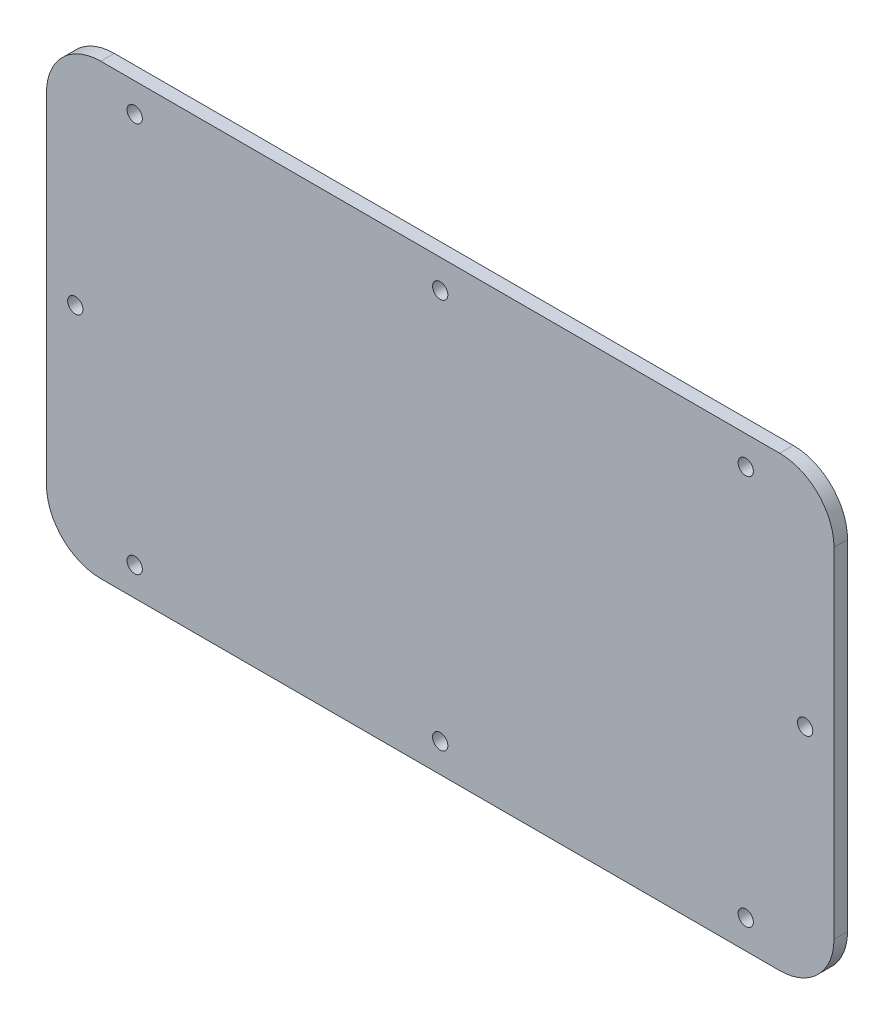
ISO-10303-21;
HEADER;
FILE_DESCRIPTION(('STEP AP214'),'2;1');
FILE_NAME('part.step','',(''),(''),'','','');
FILE_SCHEMA(('AUTOMOTIVE_DESIGN { 1 0 10303 214 1 1 1 1 }'));
ENDSEC;
DATA;
#1=APPLICATION_CONTEXT('core data for automotive mechanical design processes');
#2=APPLICATION_PROTOCOL_DEFINITION('international standard','automotive_design',2000,#1);
#3=PRODUCT_CONTEXT('',#1,'mechanical');
#4=PRODUCT('Part','Part','',(#3));
#5=PRODUCT_RELATED_PRODUCT_CATEGORY('part','',(#4));
#6=PRODUCT_DEFINITION_FORMATION('','',#4);
#7=PRODUCT_DEFINITION_CONTEXT('part definition',#1,'design');
#8=PRODUCT_DEFINITION('design','',#6,#7);
#9=PRODUCT_DEFINITION_SHAPE('','',#8);
#10=(LENGTH_UNIT() NAMED_UNIT(*) SI_UNIT(.MILLI.,.METRE.));
#11=(NAMED_UNIT(*) PLANE_ANGLE_UNIT() SI_UNIT($,.RADIAN.));
#12=(NAMED_UNIT(*) SI_UNIT($,.STERADIAN.) SOLID_ANGLE_UNIT());
#13=UNCERTAINTY_MEASURE_WITH_UNIT(LENGTH_MEASURE(1.E-05),#10,'distance_accuracy_value','');
#14=(GEOMETRIC_REPRESENTATION_CONTEXT(3) GLOBAL_UNCERTAINTY_ASSIGNED_CONTEXT((#13)) GLOBAL_UNIT_ASSIGNED_CONTEXT((#10,
#11,#12)) REPRESENTATION_CONTEXT('',''));
#15=CARTESIAN_POINT('',(0.,0.,0.));
#16=DIRECTION('',(0.,0.,1.));
#17=DIRECTION('',(1.,0.,0.));
#18=AXIS2_PLACEMENT_3D('',#15,#16,#17);
#19=CARTESIAN_POINT('',(-116.,-66.,-4.));
#20=DIRECTION('',(-1.,0.,0.));
#21=DIRECTION('',(0.,0.,1.));
#22=AXIS2_PLACEMENT_3D('',#19,#20,#21);
#23=PLANE('',#22);
#24=DIRECTION('',(0.,-1.,0.));
#25=VECTOR('',#24,1.);
#26=CARTESIAN_POINT('',(-116.,-66.,-4.));
#27=LINE('',#26,#25);
#28=CARTESIAN_POINT('',(-116.,50.,-4.));
#29=VERTEX_POINT('',#28);
#30=CARTESIAN_POINT('',(-116.,-50.,-4.));
#31=VERTEX_POINT('',#30);
#32=EDGE_CURVE('E167',#29,#31,#27,.T.);
#33=ORIENTED_EDGE('',*,*,#32,.T.);
#34=DIRECTION('',(0.,0.,1.));
#35=VECTOR('',#34,1.);
#36=CARTESIAN_POINT('',(-116.,-50.,-4.));
#37=LINE('',#36,#35);
#38=CARTESIAN_POINT('',(-116.,-50.,0.));
#39=VERTEX_POINT('',#38);
#40=EDGE_CURVE('E11',#31,#39,#37,.T.);
#41=ORIENTED_EDGE('',*,*,#40,.T.);
#42=DIRECTION('',(0.,-1.,0.));
#43=VECTOR('',#42,1.);
#44=CARTESIAN_POINT('',(-116.,-66.,0.));
#45=LINE('',#44,#43);
#46=CARTESIAN_POINT('',(-116.,50.,0.));
#47=VERTEX_POINT('',#46);
#48=EDGE_CURVE('E117',#47,#39,#45,.T.);
#49=ORIENTED_EDGE('',*,*,#48,.F.);
#50=DIRECTION('',(0.,0.,1.));
#51=VECTOR('',#50,1.);
#52=CARTESIAN_POINT('',(-116.,50.,-4.));
#53=LINE('',#52,#51);
#54=EDGE_CURVE('E53',#47,#29,#53,.F.);
#55=ORIENTED_EDGE('',*,*,#54,.T.);
#56=EDGE_LOOP('',(#33,#41,#49,#55));
#57=FACE_BOUND('',#56,.T.);
#58=ADVANCED_FACE('F45',(#57),#23,.T.);
#59=CARTESIAN_POINT('',(116.,66.,-4.));
#60=DIRECTION('',(0.,1.,0.));
#61=DIRECTION('',(-1.,0.,0.));
#62=AXIS2_PLACEMENT_3D('',#59,#60,#61);
#63=PLANE('',#62);
#64=DIRECTION('',(-1.,0.,0.));
#65=VECTOR('',#64,1.);
#66=CARTESIAN_POINT('',(116.,66.,0.));
#67=LINE('',#66,#65);
#68=CARTESIAN_POINT('',(100.,66.,0.));
#69=VERTEX_POINT('',#68);
#70=CARTESIAN_POINT('',(-100.,66.,0.));
#71=VERTEX_POINT('',#70);
#72=EDGE_CURVE('E143',#69,#71,#67,.T.);
#73=ORIENTED_EDGE('',*,*,#72,.F.);
#74=DIRECTION('',(0.,0.,1.));
#75=VECTOR('',#74,1.);
#76=CARTESIAN_POINT('',(100.,66.,-4.));
#77=LINE('',#76,#75);
#78=CARTESIAN_POINT('',(100.,66.,-4.));
#79=VERTEX_POINT('',#78);
#80=EDGE_CURVE('E67',#69,#79,#77,.F.);
#81=ORIENTED_EDGE('',*,*,#80,.T.);
#82=DIRECTION('',(-1.,0.,0.));
#83=VECTOR('',#82,1.);
#84=CARTESIAN_POINT('',(116.,66.,-4.));
#85=LINE('',#84,#83);
#86=CARTESIAN_POINT('',(-100.,66.,-4.));
#87=VERTEX_POINT('',#86);
#88=EDGE_CURVE('E137',#79,#87,#85,.T.);
#89=ORIENTED_EDGE('',*,*,#88,.T.);
#90=DIRECTION('',(0.,0.,1.));
#91=VECTOR('',#90,1.);
#92=CARTESIAN_POINT('',(-100.,66.,-4.));
#93=LINE('',#92,#91);
#94=EDGE_CURVE('E161',#87,#71,#93,.T.);
#95=ORIENTED_EDGE('',*,*,#94,.T.);
#96=EDGE_LOOP('',(#73,#81,#89,#95));
#97=FACE_BOUND('',#96,.T.);
#98=ADVANCED_FACE('F175',(#97),#63,.T.);
#99=CARTESIAN_POINT('',(116.,-66.,-4.));
#100=DIRECTION('',(1.,0.,0.));
#101=DIRECTION('',(0.,0.,-1.));
#102=AXIS2_PLACEMENT_3D('',#99,#100,#101);
#103=PLANE('',#102);
#104=DIRECTION('',(0.,1.,0.));
#105=VECTOR('',#104,1.);
#106=CARTESIAN_POINT('',(116.,-66.,0.));
#107=LINE('',#106,#105);
#108=CARTESIAN_POINT('',(116.,-50.,0.));
#109=VERTEX_POINT('',#108);
#110=CARTESIAN_POINT('',(116.,50.,0.));
#111=VERTEX_POINT('',#110);
#112=EDGE_CURVE('E132',#109,#111,#107,.T.);
#113=ORIENTED_EDGE('',*,*,#112,.F.);
#114=DIRECTION('',(0.,0.,1.));
#115=VECTOR('',#114,1.);
#116=CARTESIAN_POINT('',(116.,-50.,-4.));
#117=LINE('',#116,#115);
#118=CARTESIAN_POINT('',(116.,-50.,-4.));
#119=VERTEX_POINT('',#118);
#120=EDGE_CURVE('E153',#109,#119,#117,.F.);
#121=ORIENTED_EDGE('',*,*,#120,.T.);
#122=DIRECTION('',(0.,1.,0.));
#123=VECTOR('',#122,1.);
#124=CARTESIAN_POINT('',(116.,-66.,-4.));
#125=LINE('',#124,#123);
#126=CARTESIAN_POINT('',(116.,50.,-4.));
#127=VERTEX_POINT('',#126);
#128=EDGE_CURVE('E140',#119,#127,#125,.T.);
#129=ORIENTED_EDGE('',*,*,#128,.T.);
#130=DIRECTION('',(0.,0.,1.));
#131=VECTOR('',#130,1.);
#132=CARTESIAN_POINT('',(116.,50.,-4.));
#133=LINE('',#132,#131);
#134=EDGE_CURVE('E150',#127,#111,#133,.T.);
#135=ORIENTED_EDGE('',*,*,#134,.T.);
#136=EDGE_LOOP('',(#113,#121,#129,#135));
#137=FACE_BOUND('',#136,.T.);
#138=ADVANCED_FACE('F277',(#137),#103,.T.);
#139=CARTESIAN_POINT('',(116.,-66.,-4.));
#140=DIRECTION('',(0.,-1.,0.));
#141=DIRECTION('',(1.,0.,0.));
#142=AXIS2_PLACEMENT_3D('',#139,#140,#141);
#143=PLANE('',#142);
#144=DIRECTION('',(1.,0.,0.));
#145=VECTOR('',#144,1.);
#146=CARTESIAN_POINT('',(116.,-66.,-4.));
#147=LINE('',#146,#145);
#148=CARTESIAN_POINT('',(-100.,-66.,-4.));
#149=VERTEX_POINT('',#148);
#150=CARTESIAN_POINT('',(100.,-66.,-4.));
#151=VERTEX_POINT('',#150);
#152=EDGE_CURVE('E171',#149,#151,#147,.T.);
#153=ORIENTED_EDGE('',*,*,#152,.T.);
#154=DIRECTION('',(0.,0.,1.));
#155=VECTOR('',#154,1.);
#156=CARTESIAN_POINT('',(100.,-66.,-4.));
#157=LINE('',#156,#155);
#158=CARTESIAN_POINT('',(100.,-66.,0.));
#159=VERTEX_POINT('',#158);
#160=EDGE_CURVE('E131',#151,#159,#157,.T.);
#161=ORIENTED_EDGE('',*,*,#160,.T.);
#162=DIRECTION('',(1.,0.,0.));
#163=VECTOR('',#162,1.);
#164=CARTESIAN_POINT('',(116.,-66.,0.));
#165=LINE('',#164,#163);
#166=CARTESIAN_POINT('',(-100.,-66.,0.));
#167=VERTEX_POINT('',#166);
#168=EDGE_CURVE('E115',#167,#159,#165,.T.);
#169=ORIENTED_EDGE('',*,*,#168,.F.);
#170=DIRECTION('',(0.,0.,1.));
#171=VECTOR('',#170,1.);
#172=CARTESIAN_POINT('',(-100.,-66.,-4.));
#173=LINE('',#172,#171);
#174=EDGE_CURVE('E128',#167,#149,#173,.F.);
#175=ORIENTED_EDGE('',*,*,#174,.T.);
#176=EDGE_LOOP('',(#153,#161,#169,#175));
#177=FACE_BOUND('',#176,.T.);
#178=ADVANCED_FACE('F127',(#177),#143,.T.);
#179=CARTESIAN_POINT('',(0.,0.,-4.));
#180=DIRECTION('',(0.,0.,1.));
#181=DIRECTION('',(1.,0.,0.));
#182=AXIS2_PLACEMENT_3D('',#179,#180,#181);
#183=PLANE('',#182);
#184=CARTESIAN_POINT('',(-90.,-57.5,-4.));
#185=DIRECTION('',(0.,0.,1.));
#186=DIRECTION('',(-1.,0.,0.));
#187=AXIS2_PLACEMENT_3D('',#184,#185,#186);
#188=CIRCLE('',#187,2.25);
#189=CARTESIAN_POINT('',(-92.25,-57.5,-4.));
#190=VERTEX_POINT('',#189);
#191=EDGE_CURVE('E223',#190,#190,#188,.T.);
#192=ORIENTED_EDGE('',*,*,#191,.T.);
#193=EDGE_LOOP('',(#192));
#194=FACE_BOUND('',#193,.T.);
#195=CARTESIAN_POINT('',(0.,-57.5,-4.));
#196=DIRECTION('',(0.,0.,1.));
#197=DIRECTION('',(-1.,0.,0.));
#198=AXIS2_PLACEMENT_3D('',#195,#196,#197);
#199=CIRCLE('',#198,2.25);
#200=CARTESIAN_POINT('',(-2.25,-57.5,-4.));
#201=VERTEX_POINT('',#200);
#202=EDGE_CURVE('E217',#201,#201,#199,.T.);
#203=ORIENTED_EDGE('',*,*,#202,.T.);
#204=EDGE_LOOP('',(#203));
#205=FACE_BOUND('',#204,.T.);
#206=CARTESIAN_POINT('',(90.,-57.5,-4.));
#207=DIRECTION('',(0.,0.,1.));
#208=DIRECTION('',(-1.,0.,0.));
#209=AXIS2_PLACEMENT_3D('',#206,#207,#208);
#210=CIRCLE('',#209,2.25);
#211=CARTESIAN_POINT('',(87.75,-57.5,-4.));
#212=VERTEX_POINT('',#211);
#213=EDGE_CURVE('E211',#212,#212,#210,.T.);
#214=ORIENTED_EDGE('',*,*,#213,.T.);
#215=EDGE_LOOP('',(#214));
#216=FACE_BOUND('',#215,.T.);
#217=CARTESIAN_POINT('',(107.5,0.,-4.));
#218=DIRECTION('',(0.,0.,1.));
#219=DIRECTION('',(1.,0.,0.));
#220=AXIS2_PLACEMENT_3D('',#217,#218,#219);
#221=CIRCLE('',#220,2.25);
#222=CARTESIAN_POINT('',(109.75,0.,-4.));
#223=VERTEX_POINT('',#222);
#224=EDGE_CURVE('E205',#223,#223,#221,.T.);
#225=ORIENTED_EDGE('',*,*,#224,.T.);
#226=EDGE_LOOP('',(#225));
#227=FACE_BOUND('',#226,.T.);
#228=CARTESIAN_POINT('',(-107.5,0.,-4.));
#229=DIRECTION('',(0.,0.,1.));
#230=DIRECTION('',(1.,0.,0.));
#231=AXIS2_PLACEMENT_3D('',#228,#229,#230);
#232=CIRCLE('',#231,2.25);
#233=CARTESIAN_POINT('',(-105.25,0.,-4.));
#234=VERTEX_POINT('',#233);
#235=EDGE_CURVE('E199',#234,#234,#232,.T.);
#236=ORIENTED_EDGE('',*,*,#235,.T.);
#237=EDGE_LOOP('',(#236));
#238=FACE_BOUND('',#237,.T.);
#239=CARTESIAN_POINT('',(90.,57.5,-4.));
#240=DIRECTION('',(0.,0.,1.));
#241=DIRECTION('',(1.,0.,0.));
#242=AXIS2_PLACEMENT_3D('',#239,#240,#241);
#243=CIRCLE('',#242,2.25);
#244=CARTESIAN_POINT('',(92.25,57.5,-4.));
#245=VERTEX_POINT('',#244);
#246=EDGE_CURVE('E193',#245,#245,#243,.T.);
#247=ORIENTED_EDGE('',*,*,#246,.T.);
#248=EDGE_LOOP('',(#247));
#249=FACE_BOUND('',#248,.T.);
#250=CARTESIAN_POINT('',(-90.,57.5,-4.));
#251=DIRECTION('',(0.,0.,1.));
#252=DIRECTION('',(1.,0.,0.));
#253=AXIS2_PLACEMENT_3D('',#250,#251,#252);
#254=CIRCLE('',#253,2.25);
#255=CARTESIAN_POINT('',(-87.75,57.5,-4.));
#256=VERTEX_POINT('',#255);
#257=EDGE_CURVE('E187',#256,#256,#254,.T.);
#258=ORIENTED_EDGE('',*,*,#257,.T.);
#259=EDGE_LOOP('',(#258));
#260=FACE_BOUND('',#259,.T.);
#261=CARTESIAN_POINT('',(0.,57.5,-4.));
#262=DIRECTION('',(0.,0.,1.));
#263=DIRECTION('',(1.,0.,0.));
#264=AXIS2_PLACEMENT_3D('',#261,#262,#263);
#265=CIRCLE('',#264,2.25);
#266=CARTESIAN_POINT('',(2.25,57.5,-4.));
#267=VERTEX_POINT('',#266);
#268=EDGE_CURVE('E179',#267,#267,#265,.T.);
#269=ORIENTED_EDGE('',*,*,#268,.T.);
#270=EDGE_LOOP('',(#269));
#271=FACE_BOUND('',#270,.T.);
#272=ORIENTED_EDGE('',*,*,#128,.F.);
#273=CARTESIAN_POINT('',(100.,-50.,-4.));
#274=DIRECTION('',(0.,0.,1.));
#275=DIRECTION('',(1.,0.,0.));
#276=AXIS2_PLACEMENT_3D('',#273,#274,#275);
#277=CIRCLE('',#276,16.);
#278=EDGE_CURVE('E159',#119,#151,#277,.F.);
#279=ORIENTED_EDGE('',*,*,#278,.T.);
#280=ORIENTED_EDGE('',*,*,#152,.F.);
#281=CARTESIAN_POINT('',(-100.,-50.,-4.));
#282=DIRECTION('',(0.,0.,1.));
#283=DIRECTION('',(1.,0.,0.));
#284=AXIS2_PLACEMENT_3D('',#281,#282,#283);
#285=CIRCLE('',#284,16.);
#286=EDGE_CURVE('E136',#149,#31,#285,.F.);
#287=ORIENTED_EDGE('',*,*,#286,.T.);
#288=ORIENTED_EDGE('',*,*,#32,.F.);
#289=CARTESIAN_POINT('',(-100.,50.,-4.));
#290=DIRECTION('',(0.,0.,1.));
#291=DIRECTION('',(1.,0.,0.));
#292=AXIS2_PLACEMENT_3D('',#289,#290,#291);
#293=CIRCLE('',#292,16.);
#294=EDGE_CURVE('E60',#29,#87,#293,.F.);
#295=ORIENTED_EDGE('',*,*,#294,.T.);
#296=ORIENTED_EDGE('',*,*,#88,.F.);
#297=CARTESIAN_POINT('',(100.,50.,-4.));
#298=DIRECTION('',(0.,0.,1.));
#299=DIRECTION('',(1.,0.,0.));
#300=AXIS2_PLACEMENT_3D('',#297,#298,#299);
#301=CIRCLE('',#300,16.);
#302=EDGE_CURVE('E157',#79,#127,#301,.F.);
#303=ORIENTED_EDGE('',*,*,#302,.T.);
#304=EDGE_LOOP('',(#272,#279,#280,#287,#288,#295,#296,#303));
#305=FACE_BOUND('',#304,.T.);
#306=ADVANCED_FACE('F170',(#194,#205,#216,#227,#238,#249,#260,#271,#305),#183,.F.);
#307=CARTESIAN_POINT('',(0.,0.,0.));
#308=DIRECTION('',(0.,0.,1.));
#309=DIRECTION('',(1.,0.,0.));
#310=AXIS2_PLACEMENT_3D('',#307,#308,#309);
#311=PLANE('',#310);
#312=CARTESIAN_POINT('',(-90.,-57.5,0.));
#313=DIRECTION('',(0.,0.,1.));
#314=DIRECTION('',(-1.,0.,0.));
#315=AXIS2_PLACEMENT_3D('',#312,#313,#314);
#316=CIRCLE('',#315,2.25);
#317=CARTESIAN_POINT('',(-92.25,-57.5,0.));
#318=VERTEX_POINT('',#317);
#319=EDGE_CURVE('E226',#318,#318,#316,.T.);
#320=ORIENTED_EDGE('',*,*,#319,.F.);
#321=EDGE_LOOP('',(#320));
#322=FACE_BOUND('',#321,.T.);
#323=CARTESIAN_POINT('',(0.,-57.5,0.));
#324=DIRECTION('',(0.,0.,1.));
#325=DIRECTION('',(-1.,0.,0.));
#326=AXIS2_PLACEMENT_3D('',#323,#324,#325);
#327=CIRCLE('',#326,2.25);
#328=CARTESIAN_POINT('',(-2.25,-57.5,0.));
#329=VERTEX_POINT('',#328);
#330=EDGE_CURVE('E220',#329,#329,#327,.T.);
#331=ORIENTED_EDGE('',*,*,#330,.F.);
#332=EDGE_LOOP('',(#331));
#333=FACE_BOUND('',#332,.T.);
#334=CARTESIAN_POINT('',(90.,-57.5,0.));
#335=DIRECTION('',(0.,0.,1.));
#336=DIRECTION('',(-1.,0.,0.));
#337=AXIS2_PLACEMENT_3D('',#334,#335,#336);
#338=CIRCLE('',#337,2.25);
#339=CARTESIAN_POINT('',(87.75,-57.5,0.));
#340=VERTEX_POINT('',#339);
#341=EDGE_CURVE('E214',#340,#340,#338,.T.);
#342=ORIENTED_EDGE('',*,*,#341,.F.);
#343=EDGE_LOOP('',(#342));
#344=FACE_BOUND('',#343,.T.);
#345=CARTESIAN_POINT('',(107.5,0.,0.));
#346=DIRECTION('',(0.,0.,1.));
#347=DIRECTION('',(1.,0.,0.));
#348=AXIS2_PLACEMENT_3D('',#345,#346,#347);
#349=CIRCLE('',#348,2.25);
#350=CARTESIAN_POINT('',(109.75,0.,0.));
#351=VERTEX_POINT('',#350);
#352=EDGE_CURVE('E208',#351,#351,#349,.T.);
#353=ORIENTED_EDGE('',*,*,#352,.F.);
#354=EDGE_LOOP('',(#353));
#355=FACE_BOUND('',#354,.T.);
#356=CARTESIAN_POINT('',(-107.5,0.,0.));
#357=DIRECTION('',(0.,0.,1.));
#358=DIRECTION('',(1.,0.,0.));
#359=AXIS2_PLACEMENT_3D('',#356,#357,#358);
#360=CIRCLE('',#359,2.25);
#361=CARTESIAN_POINT('',(-105.25,0.,0.));
#362=VERTEX_POINT('',#361);
#363=EDGE_CURVE('E202',#362,#362,#360,.T.);
#364=ORIENTED_EDGE('',*,*,#363,.F.);
#365=EDGE_LOOP('',(#364));
#366=FACE_BOUND('',#365,.T.);
#367=CARTESIAN_POINT('',(90.,57.5,0.));
#368=DIRECTION('',(0.,0.,1.));
#369=DIRECTION('',(1.,0.,0.));
#370=AXIS2_PLACEMENT_3D('',#367,#368,#369);
#371=CIRCLE('',#370,2.25);
#372=CARTESIAN_POINT('',(92.25,57.5,0.));
#373=VERTEX_POINT('',#372);
#374=EDGE_CURVE('E196',#373,#373,#371,.T.);
#375=ORIENTED_EDGE('',*,*,#374,.F.);
#376=EDGE_LOOP('',(#375));
#377=FACE_BOUND('',#376,.T.);
#378=CARTESIAN_POINT('',(-90.,57.5,0.));
#379=DIRECTION('',(0.,0.,1.));
#380=DIRECTION('',(1.,0.,0.));
#381=AXIS2_PLACEMENT_3D('',#378,#379,#380);
#382=CIRCLE('',#381,2.25);
#383=CARTESIAN_POINT('',(-87.75,57.5,0.));
#384=VERTEX_POINT('',#383);
#385=EDGE_CURVE('E190',#384,#384,#382,.T.);
#386=ORIENTED_EDGE('',*,*,#385,.F.);
#387=EDGE_LOOP('',(#386));
#388=FACE_BOUND('',#387,.T.);
#389=CARTESIAN_POINT('',(0.,57.5,0.));
#390=DIRECTION('',(0.,0.,1.));
#391=DIRECTION('',(1.,0.,0.));
#392=AXIS2_PLACEMENT_3D('',#389,#390,#391);
#393=CIRCLE('',#392,2.25);
#394=CARTESIAN_POINT('',(2.25,57.5,0.));
#395=VERTEX_POINT('',#394);
#396=EDGE_CURVE('E184',#395,#395,#393,.T.);
#397=ORIENTED_EDGE('',*,*,#396,.F.);
#398=EDGE_LOOP('',(#397));
#399=FACE_BOUND('',#398,.T.);
#400=ORIENTED_EDGE('',*,*,#168,.T.);
#401=CARTESIAN_POINT('',(100.,-50.,0.));
#402=DIRECTION('',(0.,0.,1.));
#403=DIRECTION('',(1.,0.,0.));
#404=AXIS2_PLACEMENT_3D('',#401,#402,#403);
#405=CIRCLE('',#404,16.);
#406=EDGE_CURVE('E148',#159,#109,#405,.T.);
#407=ORIENTED_EDGE('',*,*,#406,.T.);
#408=ORIENTED_EDGE('',*,*,#112,.T.);
#409=CARTESIAN_POINT('',(100.,50.,0.));
#410=DIRECTION('',(0.,0.,1.));
#411=DIRECTION('',(1.,0.,0.));
#412=AXIS2_PLACEMENT_3D('',#409,#410,#411);
#413=CIRCLE('',#412,16.);
#414=EDGE_CURVE('E121',#111,#69,#413,.T.);
#415=ORIENTED_EDGE('',*,*,#414,.T.);
#416=ORIENTED_EDGE('',*,*,#72,.T.);
#417=CARTESIAN_POINT('',(-100.,50.,0.));
#418=DIRECTION('',(0.,0.,1.));
#419=DIRECTION('',(1.,0.,0.));
#420=AXIS2_PLACEMENT_3D('',#417,#418,#419);
#421=CIRCLE('',#420,16.);
#422=EDGE_CURVE('E122',#71,#47,#421,.T.);
#423=ORIENTED_EDGE('',*,*,#422,.T.);
#424=ORIENTED_EDGE('',*,*,#48,.T.);
#425=CARTESIAN_POINT('',(-100.,-50.,0.));
#426=DIRECTION('',(0.,0.,1.));
#427=DIRECTION('',(1.,0.,0.));
#428=AXIS2_PLACEMENT_3D('',#425,#426,#427);
#429=CIRCLE('',#428,16.);
#430=EDGE_CURVE('E112',#39,#167,#429,.T.);
#431=ORIENTED_EDGE('',*,*,#430,.T.);
#432=EDGE_LOOP('',(#400,#407,#408,#415,#416,#423,#424,#431));
#433=FACE_BOUND('',#432,.T.);
#434=ADVANCED_FACE('F114',(#322,#333,#344,#355,#366,#377,#388,#399,#433),#311,.T.);
#435=CARTESIAN_POINT('',(0.,57.5,-4.));
#436=DIRECTION('',(0.,0.,1.));
#437=DIRECTION('',(1.,0.,0.));
#438=AXIS2_PLACEMENT_3D('',#435,#436,#437);
#439=CYLINDRICAL_SURFACE('',#438,2.25);
#440=ORIENTED_EDGE('',*,*,#268,.F.);
#441=EDGE_LOOP('',(#440));
#442=FACE_BOUND('',#441,.T.);
#443=ORIENTED_EDGE('',*,*,#396,.T.);
#444=EDGE_LOOP('',(#443));
#445=FACE_BOUND('',#444,.T.);
#446=ADVANCED_FACE('F244',(#442,#445),#439,.F.);
#447=CARTESIAN_POINT('',(-90.,57.5,-4.));
#448=DIRECTION('',(0.,0.,1.));
#449=DIRECTION('',(1.,0.,0.));
#450=AXIS2_PLACEMENT_3D('',#447,#448,#449);
#451=CYLINDRICAL_SURFACE('',#450,2.25);
#452=ORIENTED_EDGE('',*,*,#257,.F.);
#453=EDGE_LOOP('',(#452));
#454=FACE_BOUND('',#453,.T.);
#455=ORIENTED_EDGE('',*,*,#385,.T.);
#456=EDGE_LOOP('',(#455));
#457=FACE_BOUND('',#456,.T.);
#458=ADVANCED_FACE('F261',(#454,#457),#451,.F.);
#459=CARTESIAN_POINT('',(90.,57.5,-4.));
#460=DIRECTION('',(0.,0.,1.));
#461=DIRECTION('',(1.,0.,0.));
#462=AXIS2_PLACEMENT_3D('',#459,#460,#461);
#463=CYLINDRICAL_SURFACE('',#462,2.25);
#464=ORIENTED_EDGE('',*,*,#246,.F.);
#465=EDGE_LOOP('',(#464));
#466=FACE_BOUND('',#465,.T.);
#467=ORIENTED_EDGE('',*,*,#374,.T.);
#468=EDGE_LOOP('',(#467));
#469=FACE_BOUND('',#468,.T.);
#470=ADVANCED_FACE('F267',(#466,#469),#463,.F.);
#471=CARTESIAN_POINT('',(-107.5,0.,-4.));
#472=DIRECTION('',(0.,0.,1.));
#473=DIRECTION('',(1.,0.,0.));
#474=AXIS2_PLACEMENT_3D('',#471,#472,#473);
#475=CYLINDRICAL_SURFACE('',#474,2.25);
#476=ORIENTED_EDGE('',*,*,#235,.F.);
#477=EDGE_LOOP('',(#476));
#478=FACE_BOUND('',#477,.T.);
#479=ORIENTED_EDGE('',*,*,#363,.T.);
#480=EDGE_LOOP('',(#479));
#481=FACE_BOUND('',#480,.T.);
#482=ADVANCED_FACE('F349',(#478,#481),#475,.F.);
#483=CARTESIAN_POINT('',(107.5,0.,-4.));
#484=DIRECTION('',(0.,0.,1.));
#485=DIRECTION('',(1.,0.,0.));
#486=AXIS2_PLACEMENT_3D('',#483,#484,#485);
#487=CYLINDRICAL_SURFACE('',#486,2.25);
#488=ORIENTED_EDGE('',*,*,#224,.F.);
#489=EDGE_LOOP('',(#488));
#490=FACE_BOUND('',#489,.T.);
#491=ORIENTED_EDGE('',*,*,#352,.T.);
#492=EDGE_LOOP('',(#491));
#493=FACE_BOUND('',#492,.T.);
#494=ADVANCED_FACE('F338',(#490,#493),#487,.F.);
#495=CARTESIAN_POINT('',(90.,-57.5,-4.));
#496=DIRECTION('',(0.,0.,1.));
#497=DIRECTION('',(1.,0.,0.));
#498=AXIS2_PLACEMENT_3D('',#495,#496,#497);
#499=CYLINDRICAL_SURFACE('',#498,2.25);
#500=ORIENTED_EDGE('',*,*,#213,.F.);
#501=EDGE_LOOP('',(#500));
#502=FACE_BOUND('',#501,.T.);
#503=ORIENTED_EDGE('',*,*,#341,.T.);
#504=EDGE_LOOP('',(#503));
#505=FACE_BOUND('',#504,.T.);
#506=ADVANCED_FACE('F327',(#502,#505),#499,.F.);
#507=CARTESIAN_POINT('',(0.,-57.5,-4.));
#508=DIRECTION('',(0.,0.,1.));
#509=DIRECTION('',(1.,0.,0.));
#510=AXIS2_PLACEMENT_3D('',#507,#508,#509);
#511=CYLINDRICAL_SURFACE('',#510,2.25);
#512=ORIENTED_EDGE('',*,*,#202,.F.);
#513=EDGE_LOOP('',(#512));
#514=FACE_BOUND('',#513,.T.);
#515=ORIENTED_EDGE('',*,*,#330,.T.);
#516=EDGE_LOOP('',(#515));
#517=FACE_BOUND('',#516,.T.);
#518=ADVANCED_FACE('F238',(#514,#517),#511,.F.);
#519=CARTESIAN_POINT('',(-90.,-57.5,-4.));
#520=DIRECTION('',(0.,0.,1.));
#521=DIRECTION('',(1.,0.,0.));
#522=AXIS2_PLACEMENT_3D('',#519,#520,#521);
#523=CYLINDRICAL_SURFACE('',#522,2.25);
#524=ORIENTED_EDGE('',*,*,#191,.F.);
#525=EDGE_LOOP('',(#524));
#526=FACE_BOUND('',#525,.T.);
#527=ORIENTED_EDGE('',*,*,#319,.T.);
#528=EDGE_LOOP('',(#527));
#529=FACE_BOUND('',#528,.T.);
#530=ADVANCED_FACE('F234',(#526,#529),#523,.F.);
#531=CARTESIAN_POINT('',(100.,-50.,-4.));
#532=DIRECTION('',(0.,0.,1.));
#533=DIRECTION('',(1.,0.,0.));
#534=AXIS2_PLACEMENT_3D('',#531,#532,#533);
#535=CYLINDRICAL_SURFACE('',#534,16.);
#536=ORIENTED_EDGE('',*,*,#278,.F.);
#537=ORIENTED_EDGE('',*,*,#120,.F.);
#538=ORIENTED_EDGE('',*,*,#406,.F.);
#539=ORIENTED_EDGE('',*,*,#160,.F.);
#540=EDGE_LOOP('',(#536,#537,#538,#539));
#541=FACE_BOUND('',#540,.T.);
#542=ADVANCED_FACE('F237',(#541),#535,.T.);
#543=CARTESIAN_POINT('',(100.,50.,-4.));
#544=DIRECTION('',(0.,0.,1.));
#545=DIRECTION('',(1.,0.,0.));
#546=AXIS2_PLACEMENT_3D('',#543,#544,#545);
#547=CYLINDRICAL_SURFACE('',#546,16.);
#548=ORIENTED_EDGE('',*,*,#302,.F.);
#549=ORIENTED_EDGE('',*,*,#80,.F.);
#550=ORIENTED_EDGE('',*,*,#414,.F.);
#551=ORIENTED_EDGE('',*,*,#134,.F.);
#552=EDGE_LOOP('',(#548,#549,#550,#551));
#553=FACE_BOUND('',#552,.T.);
#554=ADVANCED_FACE('F284',(#553),#547,.T.);
#555=CARTESIAN_POINT('',(-100.,-50.,-4.));
#556=DIRECTION('',(0.,0.,1.));
#557=DIRECTION('',(1.,0.,0.));
#558=AXIS2_PLACEMENT_3D('',#555,#556,#557);
#559=CYLINDRICAL_SURFACE('',#558,16.);
#560=ORIENTED_EDGE('',*,*,#286,.F.);
#561=ORIENTED_EDGE('',*,*,#174,.F.);
#562=ORIENTED_EDGE('',*,*,#430,.F.);
#563=ORIENTED_EDGE('',*,*,#40,.F.);
#564=EDGE_LOOP('',(#560,#561,#562,#563));
#565=FACE_BOUND('',#564,.T.);
#566=ADVANCED_FACE('F135',(#565),#559,.T.);
#567=CARTESIAN_POINT('',(-100.,50.,-4.));
#568=DIRECTION('',(0.,0.,1.));
#569=DIRECTION('',(1.,0.,0.));
#570=AXIS2_PLACEMENT_3D('',#567,#568,#569);
#571=CYLINDRICAL_SURFACE('',#570,16.);
#572=ORIENTED_EDGE('',*,*,#294,.F.);
#573=ORIENTED_EDGE('',*,*,#54,.F.);
#574=ORIENTED_EDGE('',*,*,#422,.F.);
#575=ORIENTED_EDGE('',*,*,#94,.F.);
#576=EDGE_LOOP('',(#572,#573,#574,#575));
#577=FACE_BOUND('',#576,.T.);
#578=ADVANCED_FACE('F47',(#577),#571,.T.);
#579=CLOSED_SHELL('',(#58,#98,#138,#178,#306,#434,#446,#458,#470,#482,#494,#506,#518,#530,#542,
#554,#566,#578));
#580=MANIFOLD_SOLID_BREP('B2',#579);
#581=ADVANCED_BREP_SHAPE_REPRESENTATION('',(#18,#580),#14);
#582=SHAPE_DEFINITION_REPRESENTATION(#9,#581);
ENDSEC;
END-ISO-10303-21;
